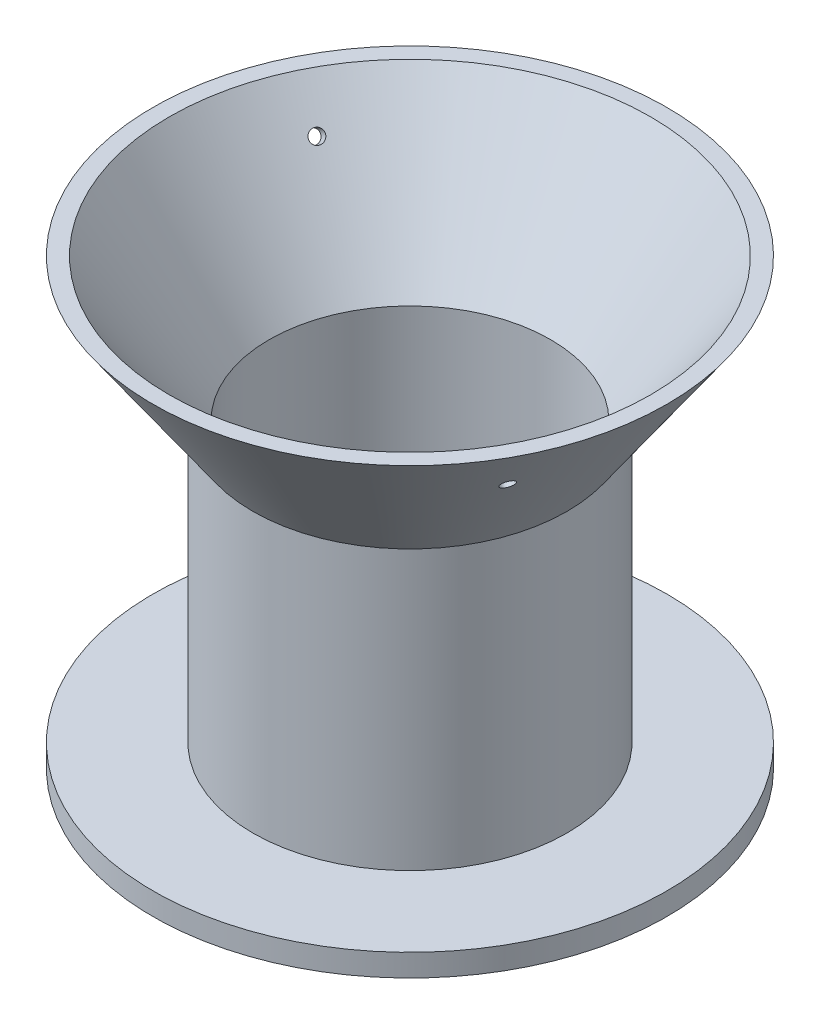
ISO-10303-21;
HEADER;
FILE_DESCRIPTION(('STEP AP214'),'2;1');
FILE_NAME('part.step','',(''),(''),'','','');
FILE_SCHEMA(('AUTOMOTIVE_DESIGN { 1 0 10303 214 1 1 1 1 }'));
ENDSEC;
DATA;
#1=APPLICATION_CONTEXT('core data for automotive mechanical design processes');
#2=APPLICATION_PROTOCOL_DEFINITION('international standard','automotive_design',2000,#1);
#3=PRODUCT_CONTEXT('',#1,'mechanical');
#4=PRODUCT('Part','Part','',(#3));
#5=PRODUCT_RELATED_PRODUCT_CATEGORY('part','',(#4));
#6=PRODUCT_DEFINITION_FORMATION('','',#4);
#7=PRODUCT_DEFINITION_CONTEXT('part definition',#1,'design');
#8=PRODUCT_DEFINITION('design','',#6,#7);
#9=PRODUCT_DEFINITION_SHAPE('','',#8);
#10=(LENGTH_UNIT() NAMED_UNIT(*) SI_UNIT(.MILLI.,.METRE.));
#11=(NAMED_UNIT(*) PLANE_ANGLE_UNIT() SI_UNIT($,.RADIAN.));
#12=(NAMED_UNIT(*) SI_UNIT($,.STERADIAN.) SOLID_ANGLE_UNIT());
#13=UNCERTAINTY_MEASURE_WITH_UNIT(LENGTH_MEASURE(1.E-05),#10,'distance_accuracy_value','');
#14=(GEOMETRIC_REPRESENTATION_CONTEXT(3) GLOBAL_UNCERTAINTY_ASSIGNED_CONTEXT((#13)) GLOBAL_UNIT_ASSIGNED_CONTEXT((#10,
#11,#12)) REPRESENTATION_CONTEXT('',''));
#15=CARTESIAN_POINT('',(0.,0.,0.));
#16=DIRECTION('',(0.,0.,1.));
#17=DIRECTION('',(1.,0.,0.));
#18=AXIS2_PLACEMENT_3D('',#15,#16,#17);
#19=CARTESIAN_POINT('',(0.,24.8956993484499,0.));
#20=DIRECTION('',(0.,1.,0.));
#21=DIRECTION('',(0.,0.,1.));
#22=AXIS2_PLACEMENT_3D('',#19,#20,#21);
#23=CONICAL_SURFACE('',#22,27.4634376586934,0.610865238198011);
#24=CARTESIAN_POINT('',(0.,18.6220373025845,0.));
#25=DIRECTION('',(0.,-1.,0.));
#26=DIRECTION('',(1.,0.,0.));
#27=AXIS2_PLACEMENT_3D('',#24,#25,#26);
#28=CIRCLE('',#27,23.0705722019983);
#29=CARTESIAN_POINT('',(23.0705722019983,18.6220373025845,0.));
#30=VERTEX_POINT('',#29);
#31=EDGE_CURVE('E259',#30,#30,#28,.T.);
#32=ORIENTED_EDGE('',*,*,#31,.T.);
#33=EDGE_LOOP('',(#32));
#34=FACE_BOUND('',#33,.T.);
#35=CARTESIAN_POINT('',(-17.5893015558669,14.2993672497077,-9.61096413361605));
#36=CARTESIAN_POINT('',(-17.6035189613711,14.3260236776415,-9.6238708044023));
#37=CARTESIAN_POINT('',(-17.6192554613632,14.3530118601868,-9.63447953581972));
#38=CARTESIAN_POINT('',(-17.6533213465278,14.4068688460513,-9.65078258631254));
#39=CARTESIAN_POINT('',(-17.6716538122646,14.4337374678458,-9.65647100874142));
#40=CARTESIAN_POINT('',(-17.7103672263708,14.4865634435641,-9.66275363933926));
#41=CARTESIAN_POINT('',(-17.7307471865282,14.5125212290129,-9.663350293185));
#42=CARTESIAN_POINT('',(-17.7729644752172,14.5628030126219,-9.65943102159392));
#43=CARTESIAN_POINT('',(-17.7948014448277,14.5871274102116,-9.65491635094159));
#44=CARTESIAN_POINT('',(-17.8393045491599,14.6334809221595,-9.64089410771097));
#45=CARTESIAN_POINT('',(-17.8619708766812,14.6555094981719,-9.63138536721915));
#46=CARTESIAN_POINT('',(-17.9074630256751,14.6966585594308,-9.60763203794173));
#47=CARTESIAN_POINT('',(-17.930288853531,14.7157789275837,-9.59338725854177));
#48=CARTESIAN_POINT('',(-17.9754323914764,14.7505906044923,-9.56055049403012));
#49=CARTESIAN_POINT('',(-17.9977499984155,14.7662812225932,-9.54195763489525));
#50=CARTESIAN_POINT('',(-18.0412163784556,14.7938007318238,-9.50094226255696));
#51=CARTESIAN_POINT('',(-18.0623651543573,14.8056296322071,-9.47851975853055));
#52=CARTESIAN_POINT('',(-18.1028734703736,14.8251037628288,-9.43047335028984));
#53=CARTESIAN_POINT('',(-18.1222331252085,14.8327492614663,-9.40484965158765));
#54=CARTESIAN_POINT('',(-18.1586019426744,14.8436504551491,-9.35112065124473));
#55=CARTESIAN_POINT('',(-18.1756111134505,14.8469061654067,-9.32301535820404));
#56=CARTESIAN_POINT('',(-18.2067863258141,14.8489394102161,-9.26512557139888));
#57=CARTESIAN_POINT('',(-18.2209530627804,14.847718041462,-9.23534149062597));
#58=CARTESIAN_POINT('',(-18.246048606551,14.8408326330705,-9.17493453857342));
#59=CARTESIAN_POINT('',(-18.2569774110083,14.8351685902127,-9.14431166668579));
#60=CARTESIAN_POINT('',(-18.2752962935893,14.8195515994009,-9.08310286903448));
#61=CARTESIAN_POINT('',(-18.2826865417672,14.8095988575947,-9.05251694156582));
#62=CARTESIAN_POINT('',(-18.2937359338752,14.7856744239979,-8.99225655576263));
#63=CARTESIAN_POINT('',(-18.2973950736341,14.7717027277143,-8.96258209844716));
#64=CARTESIAN_POINT('',(-18.300900117043,14.7401167857451,-8.90499047572484));
#65=CARTESIAN_POINT('',(-18.300745170455,14.7225017287474,-8.87707370353265));
#66=CARTESIAN_POINT('',(-18.296648022972,14.6841121545818,-8.82380854343595));
#67=CARTESIAN_POINT('',(-18.2927058176174,14.6633376336937,-8.79846015855581));
#68=CARTESIAN_POINT('',(-18.2811685744619,14.6191964659179,-8.751059338044));
#69=CARTESIAN_POINT('',(-18.2735729813852,14.5958294254108,-8.72900740410549));
#70=CARTESIAN_POINT('',(-18.2549650672113,14.547152436602,-8.68884096571743));
#71=CARTESIAN_POINT('',(-18.243952749952,14.5218424904829,-8.67072645684505));
#72=CARTESIAN_POINT('',(-18.218841797149,14.4699897472089,-8.63896013781421));
#73=CARTESIAN_POINT('',(-18.2047436434253,14.4434471430295,-8.62530763179115));
#74=CARTESIAN_POINT('',(-18.173869366871,14.3898719674803,-8.60285403205953));
#75=CARTESIAN_POINT('',(-18.1570932481387,14.3628393968606,-8.59405293092657));
#76=CARTESIAN_POINT('',(-18.1213447594277,14.3090573027011,-8.58155412537723));
#77=CARTESIAN_POINT('',(-18.1023728914671,14.2823077159827,-8.57785525691703));
#78=CARTESIAN_POINT('',(-18.0627613826868,14.2298501213097,-8.57565832566146));
#79=CARTESIAN_POINT('',(-18.0421217414195,14.2041421136349,-8.57716026426245));
#80=CARTESIAN_POINT('',(-17.9997447380059,14.1545071610063,-8.58531476407548));
#81=CARTESIAN_POINT('',(-17.9780073157683,14.1305803137295,-8.59196760752949));
#82=CARTESIAN_POINT('',(-17.9340319249287,14.0852038831406,-8.61022474784022));
#83=CARTESIAN_POINT('',(-17.9117939552348,14.0637543052344,-8.62182905550154));
#84=CARTESIAN_POINT('',(-17.8674182578462,14.0239544597708,-8.64965118023342));
#85=CARTESIAN_POINT('',(-17.8452805573542,14.0056049893608,-8.66587018103622));
#86=CARTESIAN_POINT('',(-17.8017141995119,13.9725523909275,-8.70244764030438));
#87=CARTESIAN_POINT('',(-17.780285541653,13.9578492602881,-8.7228060958));
#88=CARTESIAN_POINT('',(-17.7387212560724,13.9325241535497,-8.76707446907796));
#89=CARTESIAN_POINT('',(-17.7185856967921,13.9219023933223,-8.79098457462134));
#90=CARTESIAN_POINT('',(-17.6801623775481,13.9050573672074,-8.84166758102289));
#91=CARTESIAN_POINT('',(-17.6618746178109,13.898834101859,-8.86844048223203));
#92=CARTESIAN_POINT('',(-17.6276592744664,13.8909729578077,-8.92407625724281));
#93=CARTESIAN_POINT('',(-17.6117311216332,13.8893339714927,-8.95293862447736));
#94=CARTESIAN_POINT('',(-17.582678972686,13.8906872501671,-9.01193798450284));
#95=CARTESIAN_POINT('',(-17.5695549792523,13.8936795195828,-9.042074978512));
#96=CARTESIAN_POINT('',(-17.546490868914,13.9042050889841,-9.10276646151237));
#97=CARTESIAN_POINT('',(-17.5365503196698,13.9117377719408,-9.13332089322371));
#98=CARTESIAN_POINT('',(-17.5201463873378,13.9311186399565,-9.19398997318723));
#99=CARTESIAN_POINT('',(-17.5136828729936,13.9429666620852,-9.22410463799862));
#100=CARTESIAN_POINT('',(-17.5044349174837,13.9706270414056,-9.28305339933476));
#101=CARTESIAN_POINT('',(-17.5016507439055,13.9864396868331,-9.31188740257341));
#102=CARTESIAN_POINT('',(-17.499865193245,14.0215668326574,-9.36747457159952));
#103=CARTESIAN_POINT('',(-17.5008647571347,14.0408822030045,-9.39422721808912));
#104=CARTESIAN_POINT('',(-17.5066459671973,14.0824558180808,-9.44491339057935));
#105=CARTESIAN_POINT('',(-17.5114302677993,14.1047161191121,-9.46884492444918));
#106=CARTESIAN_POINT('',(-17.5246699881199,14.1515029739417,-9.51317992771398));
#107=CARTESIAN_POINT('',(-17.5331210035721,14.1760267811994,-9.53358758881745));
#108=CARTESIAN_POINT('',(-17.5496577154641,14.2171697450197,-9.56346074164448));
#109=CARTESIAN_POINT('',(-17.5567032411223,14.2333242202383,-9.5741678937775));
#110=CARTESIAN_POINT('',(-17.5720672269729,14.2660647242499,-9.59387264243736));
#111=CARTESIAN_POINT('',(-17.5803856871569,14.2826507530401,-9.60287023897548));
#112=CARTESIAN_POINT('',(-17.5893015558669,14.2993672497077,-9.61096413361605));
#113=B_SPLINE_CURVE_WITH_KNOTS('',3,(#35,#36,#37,#38,#39,#40,#41,#42,#43,#44,#45,#46,#47,#48,
#49,#50,#51,#52,#53,#54,#55,#56,#57,#58,#59,#60,#61,#62,#63,#64,#65,#66,#67,#68,#69,#70,#71,#72,
#73,#74,#75,#76,#77,#78,#79,#80,#81,#82,#83,#84,#85,#86,#87,#88,#89,#90,#91,#92,#93,#94,#95,#96,
#97,#98,#99,#100,#101,#102,#103,#104,#105,#106,#107,#108,#109,#110,#111,#112),.UNSPECIFIED.,.T.,
.F.,(4,2,2,2,2,2,2,2,2,2,2,2,2,2,2,2,2,2,2,2,2,2,2,2,2,2,2,2,2,2,2,2,2,2,2,2,2,2,4),(0.,
0.0984820921772583,0.197082045382401,0.295634636419945,0.394163038921912,0.492714493549843,
0.591269915121153,0.689845164727733,0.788420178121206,0.886988866388851,0.985557213076688,
1.08410141632164,1.1826456909979,1.28118522940693,1.37972487798188,1.47828649326707,
1.57684822461118,1.67542494101506,1.77400154668906,1.87256277166049,1.97112384579736,
2.06966243009446,2.16820104084814,2.26674505137172,2.36528927692956,2.46385880326101,
2.56242825887658,2.66100292730707,2.75957760782232,2.85812846955568,2.95667942548179,
3.0552169916423,3.15375083779654,3.25229184963217,3.35085736909455,3.44949207894288,
3.5480086404969,3.60976768715793,3.67152673341123),.UNSPECIFIED.);
#114=CARTESIAN_POINT('',(-17.5893015558669,14.2993672497077,-9.61096413361605));
#115=VERTEX_POINT('',#114);
#116=EDGE_CURVE('E12',#115,#115,#113,.T.);
#117=ORIENTED_EDGE('',*,*,#116,.T.);
#118=EDGE_LOOP('',(#117));
#119=FACE_BOUND('',#118,.T.);
#120=CARTESIAN_POINT('',(17.7826076270842,13.9599255134886,8.72132491610677));
#121=CARTESIAN_POINT('',(17.761417325579,13.9458150488873,8.74209327225045));
#122=CARTESIAN_POINT('',(17.7407517081181,13.9336570938814,8.76476119367181));
#123=CARTESIAN_POINT('',(17.7010512031579,13.9136251440984,8.81323943058742));
#124=CARTESIAN_POINT('',(17.6820182942927,13.9057562870442,8.83905346960877));
#125=CARTESIAN_POINT('',(17.6461356415969,13.894554372199,8.89305810424309));
#126=CARTESIAN_POINT('',(17.6292848868808,13.8912192073198,8.92124758936493));
#127=CARTESIAN_POINT('',(17.5982352789959,13.8891799851814,8.97920022828229));
#128=CARTESIAN_POINT('',(17.5840357709389,13.8904747826717,9.00896299112331));
#129=CARTESIAN_POINT('',(17.5586886947375,13.8976535063926,9.06922440148232));
#130=CARTESIAN_POINT('',(17.5475410159581,13.9035372662338,9.09972302228028));
#131=CARTESIAN_POINT('',(17.5286236703916,13.9197184967379,9.16059811999139));
#132=CARTESIAN_POINT('',(17.5208541384105,13.9300161435057,9.19097459198223));
#133=CARTESIAN_POINT('',(17.5089309969258,13.9547199849597,9.25075465122214));
#134=CARTESIAN_POINT('',(17.5047777655659,13.9691266090981,9.28015813642023));
#135=CARTESIAN_POINT('',(17.5002289177343,14.0016212456656,9.33716649683968));
#136=CARTESIAN_POINT('',(17.4998333001482,14.0197092570031,9.36477137259438));
#137=CARTESIAN_POINT('',(17.502836181972,14.0590390888729,9.41741920984108));
#138=CARTESIAN_POINT('',(17.5062356461702,14.0802817101819,9.44246151810824));
#139=CARTESIAN_POINT('',(17.5167582373267,14.1252955497291,9.48927789906822));
#140=CARTESIAN_POINT('',(17.5238813570199,14.1490667630337,9.51105197813746));
#141=CARTESIAN_POINT('',(17.541670063872,14.198446461599,9.5507240262373));
#142=CARTESIAN_POINT('',(17.5523355915562,14.224054916008,9.56862206033562));
#143=CARTESIAN_POINT('',(17.5769216445568,14.276370563895,9.60004165305983));
#144=CARTESIAN_POINT('',(17.5908421676625,14.3030777566268,9.61356321465816));
#145=CARTESIAN_POINT('',(17.6215466735348,14.3568194380453,9.63584664877262));
#146=CARTESIAN_POINT('',(17.6383299272397,14.3838538417755,9.64460973077633));
#147=CARTESIAN_POINT('',(17.6742852512789,14.4374894316883,9.65713238185322));
#148=CARTESIAN_POINT('',(17.6934573192907,14.464090618292,9.66089195579087));
#149=CARTESIAN_POINT('',(17.7336355441271,14.5161090392707,9.66329664229007));
#150=CARTESIAN_POINT('',(17.7546415379011,14.5415263785917,9.66194220907633));
#151=CARTESIAN_POINT('',(17.7978774716603,14.5904707799978,9.65415080202763));
#152=CARTESIAN_POINT('',(17.8201074135599,14.6139978391262,9.64771382024263));
#153=CARTESIAN_POINT('',(17.8651448034105,14.658515454645,9.62992778611012));
#154=CARTESIAN_POINT('',(17.887952372316,14.6795054743804,9.61857769682047));
#155=CARTESIAN_POINT('',(17.9334700740061,14.7183663758969,9.59127538226466));
#156=CARTESIAN_POINT('',(17.9561802066764,14.736237254022,9.57532315160436));
#157=CARTESIAN_POINT('',(18.0008392303687,14.7683744438443,9.53925358945914));
#158=CARTESIAN_POINT('',(18.0227879823384,14.7826401000727,9.51913550178382));
#159=CARTESIAN_POINT('',(18.0652755303943,14.8071742615771,9.47529588973369));
#160=CARTESIAN_POINT('',(18.0858143276063,14.8174427700448,9.45157436823627));
#161=CARTESIAN_POINT('',(18.1248795994033,14.8337029087461,9.40119578413134));
#162=CARTESIAN_POINT('',(18.1434063226943,14.8396950680769,9.37453908515393));
#163=CARTESIAN_POINT('',(18.1779138710204,14.8472422115966,9.31903938105916));
#164=CARTESIAN_POINT('',(18.1938947004417,14.8487972034302,9.29019637970864));
#165=CARTESIAN_POINT('',(18.222850408032,14.8474280946604,9.23114882744394));
#166=CARTESIAN_POINT('',(18.2358259917048,14.8445050465397,9.20094459808121));
#167=CARTESIAN_POINT('',(18.2584128786622,14.834260926308,9.14002832362521));
#168=CARTESIAN_POINT('',(18.2680241802727,14.8269398520085,9.10931627827925));
#169=CARTESIAN_POINT('',(18.2836224135645,14.8080978845851,9.04826186579858));
#170=CARTESIAN_POINT('',(18.289609292618,14.7965769304815,9.01791950403808));
#171=CARTESIAN_POINT('',(18.2978071992307,14.769647963822,8.95847496525789));
#172=CARTESIAN_POINT('',(18.3000182245214,14.7542399489307,8.92937278898334));
#173=CARTESIAN_POINT('',(18.3006242672265,14.7199523045087,8.87323843208837));
#174=CARTESIAN_POINT('',(18.2990183640124,14.7010718384493,8.84620675248705));
#175=CARTESIAN_POINT('',(18.2920580989521,14.6603585443954,8.79500015656258));
#176=CARTESIAN_POINT('',(18.2867037278306,14.6385257090955,8.77082524730844));
#177=CARTESIAN_POINT('',(18.2724204674638,14.5925068136397,8.72602778281772));
#178=CARTESIAN_POINT('',(18.2634912334733,14.5683205266966,8.70540557046327));
#179=CARTESIAN_POINT('',(18.2423307895703,14.5182677338638,8.66831188708996));
#180=CARTESIAN_POINT('',(18.2300995776714,14.4924012269632,8.65184041856821));
#181=CARTESIAN_POINT('',(18.2026984118629,14.4397166995921,8.6235257998232));
#182=CARTESIAN_POINT('',(18.1875289935138,14.4128988532532,8.61168180731366));
#183=CARTESIAN_POINT('',(18.15468745815,14.3590649250195,8.59295795168092));
#184=CARTESIAN_POINT('',(18.1370154421487,14.3320488511675,8.58607788826505));
#185=CARTESIAN_POINT('',(18.0996739448123,14.2785943249739,8.57747651459002));
#186=CARTESIAN_POINT('',(18.0800050598908,14.2521557030123,8.57575366866134));
#187=CARTESIAN_POINT('',(18.0392077778918,14.2005987947448,8.57750668555072));
#188=CARTESIAN_POINT('',(18.0180790201865,14.1754808373964,8.58098383731894));
#189=CARTESIAN_POINT('',(17.9749389724588,14.1272862309115,8.59303268494288));
#190=CARTESIAN_POINT('',(17.9529271679205,14.104210797732,8.60160739235389));
#191=CARTESIAN_POINT('',(17.9086516204331,14.060808594704,8.62359440828659));
#192=CARTESIAN_POINT('',(17.8863882097973,14.0404785748033,8.63700092660288));
#193=CARTESIAN_POINT('',(17.8504575802043,14.0101137677797,8.66240864798434));
#194=CARTESIAN_POINT('',(17.8366788529878,13.9990657652539,8.67307160456029));
#195=CARTESIAN_POINT('',(17.8094004656271,13.9783975523432,8.69601549725871));
#196=CARTESIAN_POINT('',(17.7959008055791,13.9687773424513,8.70829643394015));
#197=CARTESIAN_POINT('',(17.7826076270842,13.9599255134886,8.72132491610677));
#198=B_SPLINE_CURVE_WITH_KNOTS('',3,(#120,#121,#122,#123,#124,#125,#126,#127,#128,#129,#130,
#131,#132,#133,#134,#135,#136,#137,#138,#139,#140,#141,#142,#143,#144,#145,#146,#147,#148,#149,
#150,#151,#152,#153,#154,#155,#156,#157,#158,#159,#160,#161,#162,#163,#164,#165,#166,#167,#168,
#169,#170,#171,#172,#173,#174,#175,#176,#177,#178,#179,#180,#181,#182,#183,#184,#185,#186,#187,
#188,#189,#190,#191,#192,#193,#194,#195,#196,#197),.UNSPECIFIED.,.T.,.F.,(4,2,2,2,2,2,2,2,2,2,2,
2,2,2,2,2,2,2,2,2,2,2,2,2,2,2,2,2,2,2,2,2,2,2,2,2,2,2,4),(0.,0.098490160582042,0.19709804039536,
0.295660075321499,0.394197731993226,0.492731815995366,0.59126983166936,0.689818149878481,
0.788366438864264,0.886939786571135,0.985512941956048,1.08408444245123,1.18265587599811,
1.28120224338834,1.37974851497085,1.47828603390666,1.57682370697392,1.6753821871828,
1.77394078291176,1.87251728480033,1.97109370797474,2.06965793253064,2.16822198727174,
2.26676287985837,2.36530382148115,2.46384619391838,2.5623886255619,2.66095482767592,
2.75952127368449,2.85809722733248,2.9566732402843,3.05523130220903,3.15378538713027,
3.25231012258767,3.35085928392604,3.44946672449045,3.54795638950444,3.60974158080983,
3.67152679345996),.UNSPECIFIED.);
#199=CARTESIAN_POINT('',(17.7826076270842,13.9599255134886,8.72132491610677));
#200=VERTEX_POINT('',#199);
#201=EDGE_CURVE('E201',#200,#200,#198,.T.);
#202=ORIENTED_EDGE('',*,*,#201,.T.);
#203=EDGE_LOOP('',(#202));
#204=FACE_BOUND('',#203,.T.);
#205=CARTESIAN_POINT('',(0.,5.79928931524201,0.));
#206=DIRECTION('',(0.,-1.,0.));
#207=DIRECTION('',(0.,0.,-1.));
#208=AXIS2_PLACEMENT_3D('',#205,#206,#207);
#209=CIRCLE('',#208,14.0919874006978);
#210=CARTESIAN_POINT('',(0.,5.79928931524201,-14.0919874006978));
#211=VERTEX_POINT('',#210);
#212=EDGE_CURVE('E205',#211,#211,#209,.T.);
#213=ORIENTED_EDGE('',*,*,#212,.F.);
#214=EDGE_LOOP('',(#213));
#215=FACE_BOUND('',#214,.T.);
#216=ADVANCED_FACE('F193',(#34,#119,#204,#215),#23,.T.);
#217=CARTESIAN_POINT('',(0.,30.0573576436351,0.));
#218=DIRECTION('',(0.,1.,0.));
#219=DIRECTION('',(0.,0.,1.));
#220=AXIS2_PLACEMENT_3D('',#217,#218,#219);
#221=CONICAL_SURFACE('',#220,29.612740200131,0.610865238198011);
#222=CARTESIAN_POINT('',(0.,18.6220373025845,0.));
#223=DIRECTION('',(0.,-1.,0.));
#224=DIRECTION('',(1.,0.,0.));
#225=AXIS2_PLACEMENT_3D('',#222,#223,#224);
#226=CIRCLE('',#225,21.6056426954846);
#227=CARTESIAN_POINT('',(21.6056426954846,18.6220373025845,0.));
#228=VERTEX_POINT('',#227);
#229=EDGE_CURVE('E197',#228,#228,#226,.T.);
#230=ORIENTED_EDGE('',*,*,#229,.F.);
#231=EDGE_LOOP('',(#230));
#232=FACE_BOUND('',#231,.T.);
#233=CARTESIAN_POINT('',(-17.1760510044606,14.9054792942478,-8.13067965215727));
#234=CARTESIAN_POINT('',(-17.1555026675167,14.8798787256553,-8.1321915607195));
#235=CARTESIAN_POINT('',(-17.134250068723,14.8549661100555,-8.13629890649272));
#236=CARTESIAN_POINT('',(-17.0909302941707,14.8072570960029,-8.1495894407266));
#237=CARTESIAN_POINT('',(-17.0688621705865,14.7844632755552,-8.15877872050081));
#238=CARTESIAN_POINT('',(-17.0245397102006,14.7416893927237,-8.18195726269472));
#239=CARTESIAN_POINT('',(-17.0022854684999,14.7217079764536,-8.1959442043061));
#240=CARTESIAN_POINT('',(-16.9581934025651,14.685141333883,-8.22830492294172));
#241=CARTESIAN_POINT('',(-16.9363554766953,14.6685552687872,-8.24667761406527));
#242=CARTESIAN_POINT('',(-16.8936792514352,14.6392600659036,-8.28728160039637));
#243=CARTESIAN_POINT('',(-16.8728411481319,14.6265516860161,-8.30951364859159));
#244=CARTESIAN_POINT('',(-16.8327381058243,14.6053944691828,-8.35719280345823));
#245=CARTESIAN_POINT('',(-16.8134732259191,14.5969457921938,-8.38264003081857));
#246=CARTESIAN_POINT('',(-16.7770531223324,14.5845627816874,-8.43601218238577));
#247=CARTESIAN_POINT('',(-16.7598974159182,14.5806274134722,-8.46393653711705));
#248=CARTESIAN_POINT('',(-16.7281702048726,14.5773855532317,-8.52147101271956));
#249=CARTESIAN_POINT('',(-16.7135986909604,14.5780790445822,-8.5510811275361));
#250=CARTESIAN_POINT('',(-16.687458123619,14.5840733289283,-8.61113971143332));
#251=CARTESIAN_POINT('',(-16.6758883569768,14.5893730261888,-8.64158797946424));
#252=CARTESIAN_POINT('',(-16.6560851689829,14.604419490487,-8.7024705961569));
#253=CARTESIAN_POINT('',(-16.6478517443689,14.6141662531763,-8.73290494483222));
#254=CARTESIAN_POINT('',(-16.6349716679898,14.6378172690177,-8.79290889810271));
#255=CARTESIAN_POINT('',(-16.6303254231638,14.6517219936117,-8.82247840422193));
#256=CARTESIAN_POINT('',(-16.6247761641241,14.6832755256736,-8.87992249166004));
#257=CARTESIAN_POINT('',(-16.6238731611076,14.7009243443408,-8.90779706790871));
#258=CARTESIAN_POINT('',(-16.6258623624878,14.73945051249,-8.96108186325244));
#259=CARTESIAN_POINT('',(-16.6287556491608,14.760328781152,-8.98649137736993));
#260=CARTESIAN_POINT('',(-16.638283210844,14.8046975996559,-9.03412920207795));
#261=CARTESIAN_POINT('',(-16.6449174842954,14.8281881484092,-9.05635751399415));
#262=CARTESIAN_POINT('',(-16.6617616366448,14.877097455177,-9.09701350012439));
#263=CARTESIAN_POINT('',(-16.6719715374895,14.9025162250257,-9.11544115100959));
#264=CARTESIAN_POINT('',(-16.695694061218,14.9545470396533,-9.14798057544822));
#265=CARTESIAN_POINT('',(-16.7092066783073,14.9811590823386,-9.1620923565736));
#266=CARTESIAN_POINT('',(-16.7391559016572,15.0348059832063,-9.18560033870678));
#267=CARTESIAN_POINT('',(-16.7555916980513,15.0618407223934,-9.1949978430566));
#268=CARTESIAN_POINT('',(-16.7909236321293,15.1155721444589,-9.20881653106291));
#269=CARTESIAN_POINT('',(-16.8098197677839,15.142268827616,-9.21323771882405));
#270=CARTESIAN_POINT('',(-16.8495253957779,15.1945693260324,-9.21697419778987));
#271=CARTESIAN_POINT('',(-16.8703346572179,15.2201732726317,-9.21629010436545));
#272=CARTESIAN_POINT('',(-16.9132624703224,15.2695775508249,-9.20982941345751));
#273=CARTESIAN_POINT('',(-16.9353810240015,15.2933778796436,-9.20405280813829));
#274=CARTESIAN_POINT('',(-16.9802838448603,15.3385216414282,-9.18755869045187));
#275=CARTESIAN_POINT('',(-17.0030682572674,15.3598645333238,-9.17684009256264));
#276=CARTESIAN_POINT('',(-17.0486274790224,15.3995013383736,-9.15075338093293));
#277=CARTESIAN_POINT('',(-17.0714022883577,15.4177952475066,-9.13538526106022));
#278=CARTESIAN_POINT('',(-17.1162762379473,15.4508384258929,-9.10041876279394));
#279=CARTESIAN_POINT('',(-17.1383752310958,15.4655869281391,-9.08081947077366));
#280=CARTESIAN_POINT('',(-17.1812422919261,15.4911333569676,-9.03793691973593));
#281=CARTESIAN_POINT('',(-17.2020103601237,15.5019312850812,-9.01465366214638));
#282=CARTESIAN_POINT('',(-17.2416052597306,15.5192830258669,-8.96505752422758));
#283=CARTESIAN_POINT('',(-17.2604323154458,15.5258373294013,-8.9387449947106));
#284=CARTESIAN_POINT('',(-17.2956013989806,15.5345265764428,-8.88382926756963));
#285=CARTESIAN_POINT('',(-17.3119434338781,15.5366615325375,-8.85522607647036));
#286=CARTESIAN_POINT('',(-17.3416703932252,15.5364544733434,-8.79654723517398));
#287=CARTESIAN_POINT('',(-17.3550561013066,15.5341136460404,-8.76647197776496));
#288=CARTESIAN_POINT('',(-17.3785003178667,15.5250205795087,-8.7056979619773));
#289=CARTESIAN_POINT('',(-17.3885588205471,15.5182683325923,-8.67499920251217));
#290=CARTESIAN_POINT('',(-17.40507529652,15.5005349904593,-8.61385596788646));
#291=CARTESIAN_POINT('',(-17.4115333046257,15.4895539361328,-8.58341149027002));
#292=CARTESIAN_POINT('',(-17.4206845496644,15.4636602396957,-8.52364944239785));
#293=CARTESIAN_POINT('',(-17.4233777724409,15.4487475828016,-8.49433187638));
#294=CARTESIAN_POINT('',(-17.4249464718857,15.4153910382316,-8.43765878367488));
#295=CARTESIAN_POINT('',(-17.4238208799281,15.3969461634914,-8.41030380837007));
#296=CARTESIAN_POINT('',(-17.4178066634316,15.357032161424,-8.35835466718444));
#297=CARTESIAN_POINT('',(-17.4129181821677,15.3355631492686,-8.33376039622847));
#298=CARTESIAN_POINT('',(-17.3995412290851,15.2901897610013,-8.28804107455498));
#299=CARTESIAN_POINT('',(-17.3910526633136,15.2662853213436,-8.26691611439734));
#300=CARTESIAN_POINT('',(-17.3707339195299,15.2166962716827,-8.22874191100964));
#301=CARTESIAN_POINT('',(-17.3589029210994,15.1910112257895,-8.21169367033191));
#302=CARTESIAN_POINT('',(-17.3322501191545,15.1385801344522,-8.18216821082243));
#303=CARTESIAN_POINT('',(-17.3174275116045,15.1118338053296,-8.16969222338951));
#304=CARTESIAN_POINT('',(-17.2852322546683,15.0580605076181,-8.14968774918427));
#305=CARTESIAN_POINT('',(-17.2678626821898,15.0310339137128,-8.14215335191033));
#306=CARTESIAN_POINT('',(-17.2379550449643,14.9874839757512,-8.13407851099931));
#307=CARTESIAN_POINT('',(-17.2260352909679,14.9708076821694,-8.13197692720889));
#308=CARTESIAN_POINT('',(-17.2015194849561,14.9378240316364,-8.12980393341311));
#309=CARTESIAN_POINT('',(-17.1889234331761,14.9215166745568,-8.12973252270125));
#310=CARTESIAN_POINT('',(-17.1760510044606,14.9054792942478,-8.13067965215727));
#311=B_SPLINE_CURVE_WITH_KNOTS('',3,(#233,#234,#235,#236,#237,#238,#239,#240,#241,#242,#243,
#244,#245,#246,#247,#248,#249,#250,#251,#252,#253,#254,#255,#256,#257,#258,#259,#260,#261,#262,
#263,#264,#265,#266,#267,#268,#269,#270,#271,#272,#273,#274,#275,#276,#277,#278,#279,#280,#281,
#282,#283,#284,#285,#286,#287,#288,#289,#290,#291,#292,#293,#294,#295,#296,#297,#298,#299,#300,
#301,#302,#303,#304,#305,#306,#307,#308,#309,#310),.UNSPECIFIED.,.T.,.F.,(4,2,2,2,2,2,2,2,2,2,2,
2,2,2,2,2,2,2,2,2,2,2,2,2,2,2,2,2,2,2,2,2,2,2,2,2,2,2,4),(0.,0.0985107645104439,
0.197139862829302,0.29572131769567,0.394278389309699,0.492854711757413,0.591434735587509,
0.689992154950169,0.788549220349731,0.887082847179519,0.985616377662781,1.0841610844044,
1.18270608591981,1.28127918752814,1.37985224805892,1.47842591362312,1.57699940624462,
1.67554563150702,1.77409177548452,1.87262604128196,1.97116045869163,2.06971652977088,
2.16827273083571,2.26685023422505,2.36542769940617,2.46399376004377,2.56255953993602,
2.66109916161474,2.75963895501788,2.85817779562249,2.95671700675756,3.05528379457481,
3.15384682956946,3.25241243695903,3.35100225886434,3.44961861349261,3.54811679962959,
3.60982852056446,3.67154022002425),.UNSPECIFIED.);
#312=CARTESIAN_POINT('',(-17.1760510044606,14.9054792942478,-8.13067965215727));
#313=VERTEX_POINT('',#312);
#314=EDGE_CURVE('E225',#313,#313,#311,.T.);
#315=ORIENTED_EDGE('',*,*,#314,.F.);
#316=EDGE_LOOP('',(#315));
#317=FACE_BOUND('',#316,.T.);
#318=CARTESIAN_POINT('',(16.670154658525,14.593926043726,8.65950395337578));
#319=CARTESIAN_POINT('',(16.659807244681,14.6008351963677,8.68991800208535));
#320=CARTESIAN_POINT('',(16.6510974512613,14.6099844282372,8.72040607858555));
#321=CARTESIAN_POINT('',(16.637230858941,14.632496263906,8.78065528014094));
#322=CARTESIAN_POINT('',(16.6320783399014,14.645863914946,8.81041548811746));
#323=CARTESIAN_POINT('',(16.6255077704856,14.6764056021376,8.86833779258368));
#324=CARTESIAN_POINT('',(16.6240879096503,14.6935777885834,8.89650065734805));
#325=CARTESIAN_POINT('',(16.6250450315212,14.7312193233967,8.95044754575044));
#326=CARTESIAN_POINT('',(16.627421076802,14.7516878565861,8.97623215505198));
#327=CARTESIAN_POINT('',(16.6359276311845,14.7953296273028,9.02471927635114));
#328=CARTESIAN_POINT('',(16.6420590380491,14.8185035105029,9.04742104977514));
#329=CARTESIAN_POINT('',(16.6579269548307,14.8668771828799,9.0891030067931));
#330=CARTESIAN_POINT('',(16.6676636013638,14.8920770488005,9.10808304931517));
#331=CARTESIAN_POINT('',(16.6904814470885,14.9437681420784,9.14178735843746));
#332=CARTESIAN_POINT('',(16.7035620700686,14.9702591463196,9.156512357308));
#333=CARTESIAN_POINT('',(16.732707580925,15.0237761727142,9.18129764767024));
#334=CARTESIAN_POINT('',(16.7487724576575,15.0508021928694,9.19135795658015));
#335=CARTESIAN_POINT('',(16.7834273354773,15.1046132203325,9.20652698811809));
#336=CARTESIAN_POINT('',(16.802016671366,15.1313982891557,9.21163701227778));
#337=CARTESIAN_POINT('',(16.8411890211298,15.183979668531,9.21676173058662));
#338=CARTESIAN_POINT('',(16.8617720319908,15.2097759805779,9.2167764324389));
#339=CARTESIAN_POINT('',(16.9043338473879,15.2596603810243,9.21170297991059));
#340=CARTESIAN_POINT('',(16.9263127073336,15.2837484015311,9.20661462284025));
#341=CARTESIAN_POINT('',(16.9710215087795,15.3295481445816,9.19146901971588));
#342=CARTESIAN_POINT('',(16.9937514524748,15.3512598601796,9.1814117591387));
#343=CARTESIAN_POINT('',(17.0393000433642,15.3917159849988,9.15659798929557));
#344=CARTESIAN_POINT('',(17.0621187133794,15.4104595708333,9.1418401794611));
#345=CARTESIAN_POINT('',(17.1071660641212,15.4444601578908,9.10803198471974));
#346=CARTESIAN_POINT('',(17.1293947447465,15.4597171585157,9.08898159907645));
#347=CARTESIAN_POINT('',(17.1726099638119,15.4863309780419,9.04711483568012));
#348=CARTESIAN_POINT('',(17.1935963941562,15.4976874579469,9.0242981308493));
#349=CARTESIAN_POINT('',(17.2337100550888,15.5161905979683,8.97553770528047));
#350=CARTESIAN_POINT('',(17.2528372883486,15.5233372641338,8.94959398903574));
#351=CARTESIAN_POINT('',(17.2886723349828,15.5332263478403,8.89531601434548));
#352=CARTESIAN_POINT('',(17.3053807066441,15.5359697831511,8.8669823099198));
#353=CARTESIAN_POINT('',(17.3359037102013,15.5369814842108,8.80872118947463));
#354=CARTESIAN_POINT('',(17.3497183459911,15.5352497559816,8.77879377559978));
#355=CARTESIAN_POINT('',(17.3740624825537,15.5273586782654,8.71820258536537));
#356=CARTESIAN_POINT('',(17.3845926121458,15.5212001770318,8.68753895116748));
#357=CARTESIAN_POINT('',(17.4020837530353,15.5046228879403,8.62634563334622));
#358=CARTESIAN_POINT('',(17.409044760764,15.4942040958228,8.59581594985681));
#359=CARTESIAN_POINT('',(17.4192188953895,15.469386437727,8.53576136877281));
#360=CARTESIAN_POINT('',(17.4224314945513,15.4549870116721,8.506236613229));
#361=CARTESIAN_POINT('',(17.4250386820125,15.4225996546325,8.44904519474075));
#362=CARTESIAN_POINT('',(17.4244332640448,15.4046117177575,8.42137853484639));
#363=CARTESIAN_POINT('',(17.4194458964768,15.3655328383246,8.36869371609872));
#364=CARTESIAN_POINT('',(17.4150629722597,15.344441096133,8.34367624262035));
#365=CARTESIAN_POINT('',(17.4026681128534,15.2997370547253,8.29702046471274));
#366=CARTESIAN_POINT('',(17.3946561767434,15.2761247548697,8.27538216114088));
#367=CARTESIAN_POINT('',(17.3752522138766,15.2270331969878,8.2361105583269));
#368=CARTESIAN_POINT('',(17.3638602606037,15.2015539795587,8.2184771720299));
#369=CARTESIAN_POINT('',(17.338035528095,15.1494389091751,8.18772407651576));
#370=CARTESIAN_POINT('',(17.3236027578389,15.1228030596364,8.17460435396969));
#371=CARTESIAN_POINT('',(17.2921192855479,15.0691317971625,8.15325881883099));
#372=CARTESIAN_POINT('',(17.2750693045287,15.0420964961203,8.14503166141838));
#373=CARTESIAN_POINT('',(17.2388328883802,14.9883865581651,8.13369934447795));
#374=CARTESIAN_POINT('',(17.219646450923,14.9617119216452,8.13059419053138));
#375=CARTESIAN_POINT('',(17.1796757592579,14.9094899580398,8.12958959055458));
#376=CARTESIAN_POINT('',(17.1588916753433,14.8839425112626,8.13168959044968));
#377=CARTESIAN_POINT('',(17.116297529526,14.8347091853461,8.14102593547253));
#378=CARTESIAN_POINT('',(17.0944874639257,14.8110233129169,8.14826229911357));
#379=CARTESIAN_POINT('',(17.0504323110419,14.7661964999897,8.1676569660985));
#380=CARTESIAN_POINT('',(17.0281871157617,14.7450562008488,8.17981650648411));
#381=CARTESIAN_POINT('',(16.9838731343598,14.7059479150965,8.20869895259479));
#382=CARTESIAN_POINT('',(16.9618043416441,14.6879798093741,8.22542168691871));
#383=CARTESIAN_POINT('',(16.9184397996345,14.655743501449,8.26294484070288));
#384=CARTESIAN_POINT('',(16.8971441302045,14.6414756805567,8.28374568002001));
#385=CARTESIAN_POINT('',(16.8559032352826,14.6170633076099,8.32882850366576));
#386=CARTESIAN_POINT('',(16.8359583433074,14.6069197708001,8.35311134314524));
#387=CARTESIAN_POINT('',(16.7979682861503,14.591060898358,8.40445992352643));
#388=CARTESIAN_POINT('',(16.7799237385134,14.585346998388,8.43152656345189));
#389=CARTESIAN_POINT('',(16.7462581114769,14.5785304082345,8.48764214623906));
#390=CARTESIAN_POINT('',(16.7306341529278,14.5774221986762,8.51668867396577));
#391=CARTESIAN_POINT('',(16.7075487573846,14.5793781841744,8.56485254386883));
#392=CARTESIAN_POINT('',(16.6992181900523,14.5810385894668,8.58362640069534));
#393=CARTESIAN_POINT('',(16.6837623888797,14.5861482804993,8.62142513798526));
#394=CARTESIAN_POINT('',(16.6766371545881,14.5895975655696,8.64045001835468));
#395=CARTESIAN_POINT('',(16.670154658525,14.593926043726,8.65950395337578));
#396=B_SPLINE_CURVE_WITH_KNOTS('',3,(#318,#319,#320,#321,#322,#323,#324,#325,#326,#327,#328,
#329,#330,#331,#332,#333,#334,#335,#336,#337,#338,#339,#340,#341,#342,#343,#344,#345,#346,#347,
#348,#349,#350,#351,#352,#353,#354,#355,#356,#357,#358,#359,#360,#361,#362,#363,#364,#365,#366,
#367,#368,#369,#370,#371,#372,#373,#374,#375,#376,#377,#378,#379,#380,#381,#382,#383,#384,#385,
#386,#387,#388,#389,#390,#391,#392,#393,#394,#395),.UNSPECIFIED.,.T.,.F.,(4,2,2,2,2,2,2,2,2,2,2,
2,2,2,2,2,2,2,2,2,2,2,2,2,2,2,2,2,2,2,2,2,2,2,2,2,2,2,4),(0.,0.0985066790961336,
0.197131668892531,0.295708813568137,0.394261617694252,0.492837991212628,0.591418100537751,
0.689981234634621,0.788544000688529,0.887080845525231,0.985617541393126,1.08415815122105,
1.18269904906581,1.28126723535565,1.37983543855493,1.47841220620265,1.57698883220473,
1.67554266976468,1.77409637470536,1.87263119992517,1.97116612366643,2.06971491837281,
2.16826387484399,2.26683826509068,2.36541268034825,2.46398495268893,2.56255693394117,
2.66110180816236,2.75964678976405,2.85818128196712,2.95671612932527,3.05527575081697,
3.15383167075509,3.25239774274482,3.35098806335083,3.44961032411453,3.5481143636334,
3.60982731028502,3.6715402338279),.UNSPECIFIED.);
#397=CARTESIAN_POINT('',(16.670154658525,14.593926043726,8.65950395337578));
#398=VERTEX_POINT('',#397);
#399=EDGE_CURVE('E231',#398,#398,#396,.T.);
#400=ORIENTED_EDGE('',*,*,#399,.F.);
#401=EDGE_LOOP('',(#400));
#402=FACE_BOUND('',#401,.T.);
#403=CARTESIAN_POINT('',(0.,5.79928931524201,0.));
#404=DIRECTION('',(0.,-1.,0.));
#405=DIRECTION('',(0.,0.,-1.));
#406=AXIS2_PLACEMENT_3D('',#403,#404,#405);
#407=CIRCLE('',#406,12.6270578941841);
#408=CARTESIAN_POINT('',(0.,5.79928931524201,-12.6270578941841));
#409=VERTEX_POINT('',#408);
#410=EDGE_CURVE('E233',#409,#409,#407,.F.);
#411=ORIENTED_EDGE('',*,*,#410,.F.);
#412=EDGE_LOOP('',(#411));
#413=FACE_BOUND('',#412,.T.);
#414=ADVANCED_FACE('F237',(#232,#317,#402,#413),#221,.F.);
#415=CARTESIAN_POINT('',(17.9026462238675,14.3690659200139,9.12185386435574));
#416=DIRECTION('',(0.729869815763735,-0.573576436351043,0.371887245949428));
#417=DIRECTION('',(0.61789301544549,0.786262183666288,0.));
#418=AXIS2_PLACEMENT_3D('',#415,#416,#417);
#419=CYLINDRICAL_SURFACE('',#418,0.585);
#420=ORIENTED_EDGE('',*,*,#399,.T.);
#421=EDGE_LOOP('',(#420));
#422=FACE_BOUND('',#421,.T.);
#423=ORIENTED_EDGE('',*,*,#201,.F.);
#424=EDGE_LOOP('',(#423));
#425=FACE_BOUND('',#424,.T.);
#426=ADVANCED_FACE('F219',(#422,#425),#419,.F.);
#427=CARTESIAN_POINT('',(-17.9026462238676,14.3690659200139,-9.12185386435573));
#428=DIRECTION('',(-0.729869815763735,-0.573576436351042,-0.371887245949428));
#429=DIRECTION('',(0.61789301544549,-0.786262183666288,0.));
#430=AXIS2_PLACEMENT_3D('',#427,#428,#429);
#431=CYLINDRICAL_SURFACE('',#430,0.584999999999999);
#432=ORIENTED_EDGE('',*,*,#314,.T.);
#433=EDGE_LOOP('',(#432));
#434=FACE_BOUND('',#433,.T.);
#435=ORIENTED_EDGE('',*,*,#116,.F.);
#436=EDGE_LOOP('',(#435));
#437=FACE_BOUND('',#436,.T.);
#438=ADVANCED_FACE('F214',(#434,#437),#431,.F.);
#439=CARTESIAN_POINT('',(0.,-19.200710684758,0.));
#440=DIRECTION('',(0.,1.,0.));
#441=DIRECTION('',(0.,0.,1.));
#442=AXIS2_PLACEMENT_3D('',#439,#440,#441);
#443=CYLINDRICAL_SURFACE('',#442,12.6270578941841);
#444=ORIENTED_EDGE('',*,*,#410,.T.);
#445=EDGE_LOOP('',(#444));
#446=FACE_BOUND('',#445,.T.);
#447=CARTESIAN_POINT('',(0.,-21.200710684758,0.));
#448=DIRECTION('',(0.,-1.,0.));
#449=DIRECTION('',(0.,0.,-1.));
#450=AXIS2_PLACEMENT_3D('',#447,#448,#449);
#451=CIRCLE('',#450,12.6270578941841);
#452=CARTESIAN_POINT('',(0.,-21.200710684758,-12.6270578941841));
#453=VERTEX_POINT('',#452);
#454=EDGE_CURVE('E269',#453,#453,#451,.T.);
#455=ORIENTED_EDGE('',*,*,#454,.T.);
#456=EDGE_LOOP('',(#455));
#457=FACE_BOUND('',#456,.T.);
#458=ADVANCED_FACE('F218',(#446,#457),#443,.F.);
#459=CARTESIAN_POINT('',(0.,-19.200710684758,0.));
#460=DIRECTION('',(0.,1.,0.));
#461=DIRECTION('',(0.,0.,1.));
#462=AXIS2_PLACEMENT_3D('',#459,#460,#461);
#463=CYLINDRICAL_SURFACE('',#462,14.0919874006978);
#464=CARTESIAN_POINT('',(0.,-19.200710684758,0.));
#465=DIRECTION('',(0.,-1.,0.));
#466=DIRECTION('',(0.,0.,-1.));
#467=AXIS2_PLACEMENT_3D('',#464,#465,#466);
#468=CIRCLE('',#467,14.0919874006978);
#469=CARTESIAN_POINT('',(0.,-19.200710684758,-14.0919874006978));
#470=VERTEX_POINT('',#469);
#471=EDGE_CURVE('E232',#470,#470,#468,.T.);
#472=ORIENTED_EDGE('',*,*,#471,.F.);
#473=EDGE_LOOP('',(#472));
#474=FACE_BOUND('',#473,.T.);
#475=ORIENTED_EDGE('',*,*,#212,.T.);
#476=EDGE_LOOP('',(#475));
#477=FACE_BOUND('',#476,.T.);
#478=ADVANCED_FACE('F293',(#474,#477),#463,.T.);
#479=CARTESIAN_POINT('',(-37.5365623413066,18.6220373025845,32.1841184154548));
#480=DIRECTION('',(0.,-1.,0.));
#481=DIRECTION('',(1.,0.,0.));
#482=AXIS2_PLACEMENT_3D('',#479,#480,#481);
#483=PLANE('',#482);
#484=ORIENTED_EDGE('',*,*,#229,.T.);
#485=EDGE_LOOP('',(#484));
#486=FACE_BOUND('',#485,.T.);
#487=ORIENTED_EDGE('',*,*,#31,.F.);
#488=EDGE_LOOP('',(#487));
#489=FACE_BOUND('',#488,.T.);
#490=ADVANCED_FACE('F288',(#486,#489),#483,.F.);
#491=CARTESIAN_POINT('',(0.,-19.200710684758,0.));
#492=DIRECTION('',(0.,-1.,0.));
#493=DIRECTION('',(0.,0.,-1.));
#494=AXIS2_PLACEMENT_3D('',#491,#492,#493);
#495=PLANE('',#494);
#496=CARTESIAN_POINT('',(0.,-19.200710684758,0.));
#497=DIRECTION('',(0.,-1.,0.));
#498=DIRECTION('',(0.,0.,-1.));
#499=AXIS2_PLACEMENT_3D('',#496,#497,#498);
#500=CIRCLE('',#499,23.0705722019983);
#501=CARTESIAN_POINT('',(0.,-19.200710684758,-23.0705722019983));
#502=VERTEX_POINT('',#501);
#503=EDGE_CURVE('E266',#502,#502,#500,.T.);
#504=ORIENTED_EDGE('',*,*,#503,.F.);
#505=EDGE_LOOP('',(#504));
#506=FACE_BOUND('',#505,.T.);
#507=ORIENTED_EDGE('',*,*,#471,.T.);
#508=EDGE_LOOP('',(#507));
#509=FACE_BOUND('',#508,.T.);
#510=ADVANCED_FACE('F279',(#506,#509),#495,.F.);
#511=CARTESIAN_POINT('',(0.,-21.200710684758,0.));
#512=DIRECTION('',(0.,-1.,0.));
#513=DIRECTION('',(0.,0.,-1.));
#514=AXIS2_PLACEMENT_3D('',#511,#512,#513);
#515=PLANE('',#514);
#516=CARTESIAN_POINT('',(0.,-21.200710684758,0.));
#517=DIRECTION('',(0.,-1.,0.));
#518=DIRECTION('',(0.,0.,-1.));
#519=AXIS2_PLACEMENT_3D('',#516,#517,#518);
#520=CIRCLE('',#519,23.0705722019983);
#521=CARTESIAN_POINT('',(0.,-21.200710684758,-23.0705722019983));
#522=VERTEX_POINT('',#521);
#523=EDGE_CURVE('E264',#522,#522,#520,.T.);
#524=ORIENTED_EDGE('',*,*,#523,.T.);
#525=EDGE_LOOP('',(#524));
#526=FACE_BOUND('',#525,.T.);
#527=ORIENTED_EDGE('',*,*,#454,.F.);
#528=EDGE_LOOP('',(#527));
#529=FACE_BOUND('',#528,.T.);
#530=ADVANCED_FACE('F276',(#526,#529),#515,.T.);
#531=CARTESIAN_POINT('',(0.,-21.200710684758,0.));
#532=DIRECTION('',(0.,1.,0.));
#533=DIRECTION('',(0.,0.,1.));
#534=AXIS2_PLACEMENT_3D('',#531,#532,#533);
#535=CYLINDRICAL_SURFACE('',#534,23.0705722019983);
#536=ORIENTED_EDGE('',*,*,#523,.F.);
#537=EDGE_LOOP('',(#536));
#538=FACE_BOUND('',#537,.T.);
#539=ORIENTED_EDGE('',*,*,#503,.T.);
#540=EDGE_LOOP('',(#539));
#541=FACE_BOUND('',#540,.T.);
#542=ADVANCED_FACE('F278',(#538,#541),#535,.T.);
#543=CLOSED_SHELL('',(#216,#414,#426,#438,#458,#478,#490,#510,#530,#542));
#544=MANIFOLD_SOLID_BREP('B2',#543);
#545=ADVANCED_BREP_SHAPE_REPRESENTATION('',(#18,#544),#14);
#546=SHAPE_DEFINITION_REPRESENTATION(#9,#545);
ENDSEC;
END-ISO-10303-21;
